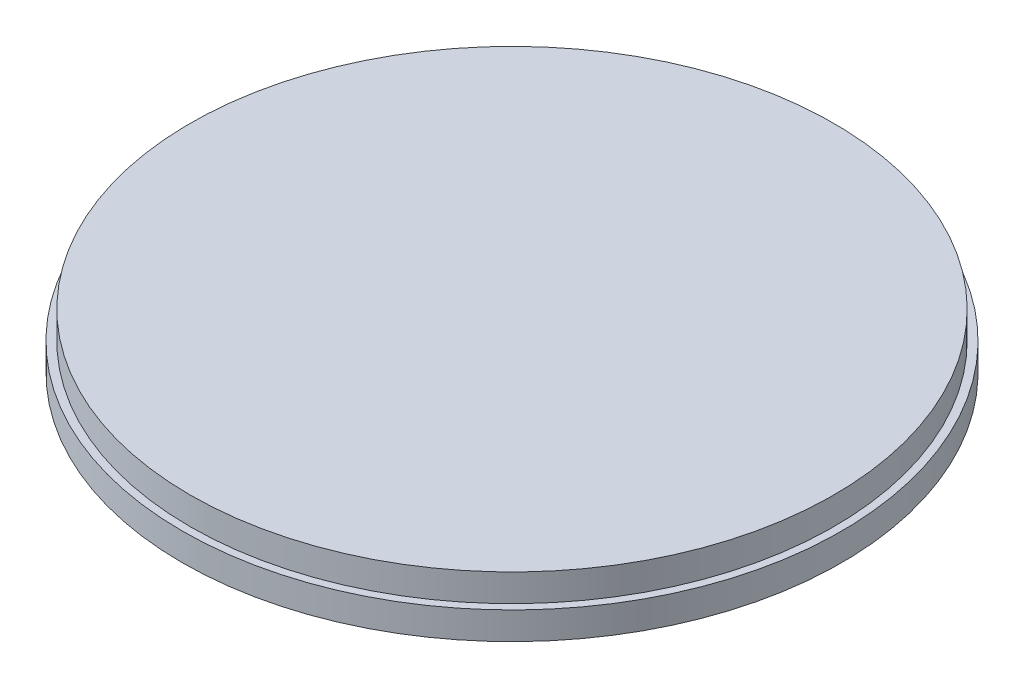
ISO-10303-21;
HEADER;
FILE_DESCRIPTION(('STEP AP214'),'2;1');
FILE_NAME('part.step','',(''),(''),'','','');
FILE_SCHEMA(('AUTOMOTIVE_DESIGN { 1 0 10303 214 1 1 1 1 }'));
ENDSEC;
DATA;
#1=APPLICATION_CONTEXT('core data for automotive mechanical design processes');
#2=APPLICATION_PROTOCOL_DEFINITION('international standard','automotive_design',2000,#1);
#3=PRODUCT_CONTEXT('',#1,'mechanical');
#4=PRODUCT('Part','Part','',(#3));
#5=PRODUCT_RELATED_PRODUCT_CATEGORY('part','',(#4));
#6=PRODUCT_DEFINITION_FORMATION('','',#4);
#7=PRODUCT_DEFINITION_CONTEXT('part definition',#1,'design');
#8=PRODUCT_DEFINITION('design','',#6,#7);
#9=PRODUCT_DEFINITION_SHAPE('','',#8);
#10=(LENGTH_UNIT() NAMED_UNIT(*) SI_UNIT(.MILLI.,.METRE.));
#11=(NAMED_UNIT(*) PLANE_ANGLE_UNIT() SI_UNIT($,.RADIAN.));
#12=(NAMED_UNIT(*) SI_UNIT($,.STERADIAN.) SOLID_ANGLE_UNIT());
#13=UNCERTAINTY_MEASURE_WITH_UNIT(LENGTH_MEASURE(1.E-05),#10,'distance_accuracy_value','');
#14=(GEOMETRIC_REPRESENTATION_CONTEXT(3) GLOBAL_UNCERTAINTY_ASSIGNED_CONTEXT((#13)) GLOBAL_UNIT_ASSIGNED_CONTEXT((#10,
#11,#12)) REPRESENTATION_CONTEXT('',''));
#15=CARTESIAN_POINT('',(0.,0.,0.));
#16=DIRECTION('',(0.,0.,1.));
#17=DIRECTION('',(1.,0.,0.));
#18=AXIS2_PLACEMENT_3D('',#15,#16,#17);
#19=CARTESIAN_POINT('',(0.,6.35,0.));
#20=DIRECTION('',(0.,-1.,0.));
#21=DIRECTION('',(0.,0.,-1.));
#22=AXIS2_PLACEMENT_3D('',#19,#20,#21);
#23=CYLINDRICAL_SURFACE('',#22,76.2);
#24=CARTESIAN_POINT('',(0.,6.35,0.));
#25=DIRECTION('',(0.,1.,0.));
#26=DIRECTION('',(0.,0.,1.));
#27=AXIS2_PLACEMENT_3D('',#24,#25,#26);
#28=CIRCLE('',#27,76.2);
#29=CARTESIAN_POINT('',(0.,6.35,76.2));
#30=VERTEX_POINT('',#29);
#31=EDGE_CURVE('E45',#30,#30,#28,.T.);
#32=ORIENTED_EDGE('',*,*,#31,.F.);
#33=EDGE_LOOP('',(#32));
#34=FACE_BOUND('',#33,.T.);
#35=CARTESIAN_POINT('',(0.,0.,0.));
#36=DIRECTION('',(0.,1.,0.));
#37=DIRECTION('',(0.,0.,1.));
#38=AXIS2_PLACEMENT_3D('',#35,#36,#37);
#39=CIRCLE('',#38,76.2);
#40=CARTESIAN_POINT('',(0.,0.,76.2));
#41=VERTEX_POINT('',#40);
#42=EDGE_CURVE('E40',#41,#41,#39,.T.);
#43=ORIENTED_EDGE('',*,*,#42,.T.);
#44=EDGE_LOOP('',(#43));
#45=FACE_BOUND('',#44,.T.);
#46=ADVANCED_FACE('F37',(#34,#45),#23,.T.);
#47=CARTESIAN_POINT('',(0.,6.35,0.));
#48=DIRECTION('',(0.,1.,0.));
#49=DIRECTION('',(0.,0.,1.));
#50=AXIS2_PLACEMENT_3D('',#47,#48,#49);
#51=PLANE('',#50);
#52=CARTESIAN_POINT('',(0.,6.35,0.));
#53=DIRECTION('',(0.,1.,0.));
#54=DIRECTION('',(0.,0.,1.));
#55=AXIS2_PLACEMENT_3D('',#52,#53,#54);
#56=CIRCLE('',#55,74.422);
#57=CARTESIAN_POINT('',(0.,6.35,74.422));
#58=VERTEX_POINT('',#57);
#59=EDGE_CURVE('E10',#58,#58,#56,.T.);
#60=ORIENTED_EDGE('',*,*,#59,.F.);
#61=EDGE_LOOP('',(#60));
#62=FACE_BOUND('',#61,.T.);
#63=ORIENTED_EDGE('',*,*,#31,.T.);
#64=EDGE_LOOP('',(#63));
#65=FACE_BOUND('',#64,.T.);
#66=ADVANCED_FACE('F65',(#62,#65),#51,.T.);
#67=CARTESIAN_POINT('',(0.,0.,0.));
#68=DIRECTION('',(0.,1.,0.));
#69=DIRECTION('',(0.,0.,1.));
#70=AXIS2_PLACEMENT_3D('',#67,#68,#69);
#71=PLANE('',#70);
#72=ORIENTED_EDGE('',*,*,#42,.F.);
#73=EDGE_LOOP('',(#72));
#74=FACE_BOUND('',#73,.T.);
#75=ADVANCED_FACE('F62',(#74),#71,.F.);
#76=CARTESIAN_POINT('',(0.,12.7,0.));
#77=DIRECTION('',(0.,-1.,0.));
#78=DIRECTION('',(0.,0.,-1.));
#79=AXIS2_PLACEMENT_3D('',#76,#77,#78);
#80=CYLINDRICAL_SURFACE('',#79,74.422);
#81=CARTESIAN_POINT('',(0.,12.7,0.));
#82=DIRECTION('',(0.,1.,0.));
#83=DIRECTION('',(0.,0.,1.));
#84=AXIS2_PLACEMENT_3D('',#81,#82,#83);
#85=CIRCLE('',#84,74.422);
#86=CARTESIAN_POINT('',(0.,12.7,74.422));
#87=VERTEX_POINT('',#86);
#88=EDGE_CURVE('E52',#87,#87,#85,.T.);
#89=ORIENTED_EDGE('',*,*,#88,.F.);
#90=EDGE_LOOP('',(#89));
#91=FACE_BOUND('',#90,.T.);
#92=ORIENTED_EDGE('',*,*,#59,.T.);
#93=EDGE_LOOP('',(#92));
#94=FACE_BOUND('',#93,.T.);
#95=ADVANCED_FACE('F64',(#91,#94),#80,.T.);
#96=CARTESIAN_POINT('',(0.,12.7,0.));
#97=DIRECTION('',(0.,1.,0.));
#98=DIRECTION('',(0.,0.,1.));
#99=AXIS2_PLACEMENT_3D('',#96,#97,#98);
#100=PLANE('',#99);
#101=ORIENTED_EDGE('',*,*,#88,.T.);
#102=EDGE_LOOP('',(#101));
#103=FACE_BOUND('',#102,.T.);
#104=ADVANCED_FACE('F70',(#103),#100,.T.);
#105=CLOSED_SHELL('',(#46,#66,#75,#95,#104));
#106=MANIFOLD_SOLID_BREP('B2',#105);
#107=ADVANCED_BREP_SHAPE_REPRESENTATION('',(#18,#106),#14);
#108=SHAPE_DEFINITION_REPRESENTATION(#9,#107);
ENDSEC;
END-ISO-10303-21;
